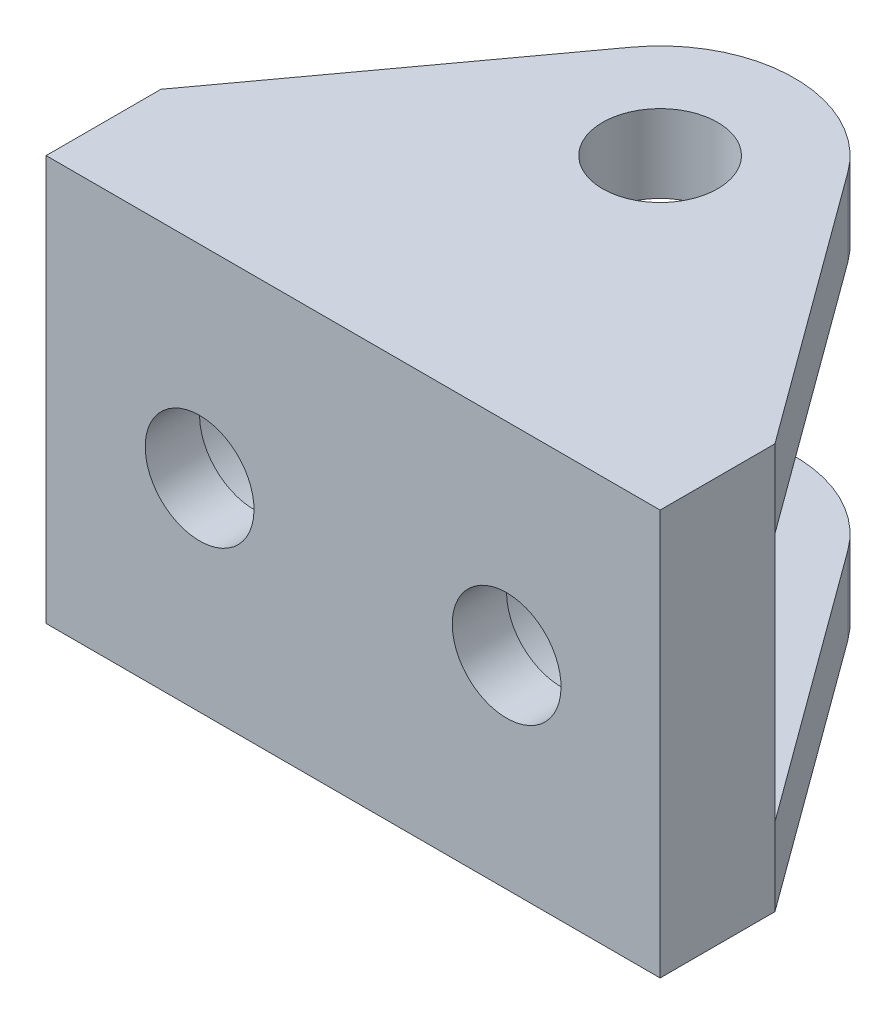
ISO-10303-21;
HEADER;
FILE_DESCRIPTION(('STEP AP214'),'2;1');
FILE_NAME('part.step','',(''),(''),'','','');
FILE_SCHEMA(('AUTOMOTIVE_DESIGN { 1 0 10303 214 1 1 1 1 }'));
ENDSEC;
DATA;
#1=APPLICATION_CONTEXT('core data for automotive mechanical design processes');
#2=APPLICATION_PROTOCOL_DEFINITION('international standard','automotive_design',2000,#1);
#3=PRODUCT_CONTEXT('',#1,'mechanical');
#4=PRODUCT('Part','Part','',(#3));
#5=PRODUCT_RELATED_PRODUCT_CATEGORY('part','',(#4));
#6=PRODUCT_DEFINITION_FORMATION('','',#4);
#7=PRODUCT_DEFINITION_CONTEXT('part definition',#1,'design');
#8=PRODUCT_DEFINITION('design','',#6,#7);
#9=PRODUCT_DEFINITION_SHAPE('','',#8);
#10=(LENGTH_UNIT() NAMED_UNIT(*) SI_UNIT(.MILLI.,.METRE.));
#11=(NAMED_UNIT(*) PLANE_ANGLE_UNIT() SI_UNIT($,.RADIAN.));
#12=(NAMED_UNIT(*) SI_UNIT($,.STERADIAN.) SOLID_ANGLE_UNIT());
#13=UNCERTAINTY_MEASURE_WITH_UNIT(LENGTH_MEASURE(1.E-05),#10,'distance_accuracy_value','');
#14=(GEOMETRIC_REPRESENTATION_CONTEXT(3) GLOBAL_UNCERTAINTY_ASSIGNED_CONTEXT((#13)) GLOBAL_UNIT_ASSIGNED_CONTEXT((#10,
#11,#12)) REPRESENTATION_CONTEXT('',''));
#15=CARTESIAN_POINT('',(0.,0.,0.));
#16=DIRECTION('',(0.,0.,1.));
#17=DIRECTION('',(1.,0.,0.));
#18=AXIS2_PLACEMENT_3D('',#15,#16,#17);
#19=CARTESIAN_POINT('',(50.8,33.528,-9.4996));
#20=DIRECTION('',(-0.807099806213913,0.,0.590415025900819));
#21=DIRECTION('',(0.590415025900819,0.,0.807099806213913));
#22=AXIS2_PLACEMENT_3D('',#19,#20,#21);
#23=PLANE('',#22);
#24=DIRECTION('',(0.,-1.,0.));
#25=VECTOR('',#24,1.);
#26=CARTESIAN_POINT('',(50.8,33.528,-9.4996));
#27=LINE('',#26,#25);
#28=CARTESIAN_POINT('',(50.8,33.528,-9.4996));
#29=VERTEX_POINT('',#28);
#30=CARTESIAN_POINT('',(50.8,27.0891,-9.4996));
#31=VERTEX_POINT('',#30);
#32=EDGE_CURVE('E181',#29,#31,#27,.T.);
#33=ORIENTED_EDGE('',*,*,#32,.T.);
#34=DIRECTION('',(-0.590415025900819,0.,-0.807099806213913));
#35=VECTOR('',#34,1.);
#36=CARTESIAN_POINT('',(50.8,27.0891,-9.4996));
#37=LINE('',#36,#35);
#38=CARTESIAN_POINT('',(34.3688965965521,27.0891,-31.9609869753228));
#39=VERTEX_POINT('',#38);
#40=EDGE_CURVE('E135',#31,#39,#37,.T.);
#41=ORIENTED_EDGE('',*,*,#40,.T.);
#42=DIRECTION('',(0.,-1.,0.));
#43=VECTOR('',#42,1.);
#44=CARTESIAN_POINT('',(34.3688965965521,33.528,-31.9609869753228));
#45=LINE('',#44,#43);
#46=CARTESIAN_POINT('',(34.3688965965521,33.528,-31.9609869753228));
#47=VERTEX_POINT('',#46);
#48=EDGE_CURVE('E133',#47,#39,#45,.T.);
#49=ORIENTED_EDGE('',*,*,#48,.F.);
#50=DIRECTION('',(-0.590415025900819,0.,-0.807099806213913));
#51=VECTOR('',#50,1.);
#52=CARTESIAN_POINT('',(50.8,33.528,-9.4996));
#53=LINE('',#52,#51);
#54=EDGE_CURVE('E117',#29,#47,#53,.T.);
#55=ORIENTED_EDGE('',*,*,#54,.F.);
#56=EDGE_LOOP('',(#33,#41,#49,#55));
#57=FACE_BOUND('',#56,.T.);
#58=ADVANCED_FACE('F45',(#57),#23,.F.);
#59=CARTESIAN_POINT('',(25.4,33.528,-25.4));
#60=DIRECTION('',(0.,-1.,0.));
#61=DIRECTION('',(0.,0.,-1.));
#62=AXIS2_PLACEMENT_3D('',#59,#60,#61);
#63=CYLINDRICAL_SURFACE('',#62,11.1125);
#64=ORIENTED_EDGE('',*,*,#48,.T.);
#65=CARTESIAN_POINT('',(25.4,27.0891,-25.4));
#66=DIRECTION('',(0.,1.,0.));
#67=DIRECTION('',(0.,0.,1.));
#68=AXIS2_PLACEMENT_3D('',#65,#66,#67);
#69=CIRCLE('',#68,11.1125);
#70=CARTESIAN_POINT('',(16.4311034034479,27.0891,-31.9609869753229));
#71=VERTEX_POINT('',#70);
#72=EDGE_CURVE('E221',#39,#71,#69,.T.);
#73=ORIENTED_EDGE('',*,*,#72,.T.);
#74=DIRECTION('',(0.,-1.,0.));
#75=VECTOR('',#74,1.);
#76=CARTESIAN_POINT('',(16.4311034034479,33.528,-31.9609869753229));
#77=LINE('',#76,#75);
#78=CARTESIAN_POINT('',(16.4311034034479,33.528,-31.9609869753229));
#79=VERTEX_POINT('',#78);
#80=EDGE_CURVE('E144',#79,#71,#77,.T.);
#81=ORIENTED_EDGE('',*,*,#80,.F.);
#82=CARTESIAN_POINT('',(25.4,33.528,-25.4));
#83=DIRECTION('',(0.,1.,0.));
#84=DIRECTION('',(0.,0.,1.));
#85=AXIS2_PLACEMENT_3D('',#82,#83,#84);
#86=CIRCLE('',#85,11.1125);
#87=EDGE_CURVE('E122',#47,#79,#86,.T.);
#88=ORIENTED_EDGE('',*,*,#87,.F.);
#89=EDGE_LOOP('',(#64,#73,#81,#88));
#90=FACE_BOUND('',#89,.T.);
#91=ADVANCED_FACE('F142',(#90),#63,.T.);
#92=CARTESIAN_POINT('',(0.,33.528,-9.4996));
#93=DIRECTION('',(0.807099806213913,0.,0.590415025900819));
#94=DIRECTION('',(0.590415025900819,0.,-0.807099806213913));
#95=AXIS2_PLACEMENT_3D('',#92,#93,#94);
#96=PLANE('',#95);
#97=ORIENTED_EDGE('',*,*,#80,.T.);
#98=DIRECTION('',(-0.590415025900819,0.,0.807099806213913));
#99=VECTOR('',#98,1.);
#100=CARTESIAN_POINT('',(0.,27.0891,-9.4996));
#101=LINE('',#100,#99);
#102=CARTESIAN_POINT('',(0.,27.0891,-9.49959999999996));
#103=VERTEX_POINT('',#102);
#104=EDGE_CURVE('E217',#71,#103,#101,.T.);
#105=ORIENTED_EDGE('',*,*,#104,.T.);
#106=DIRECTION('',(0.,-1.,0.));
#107=VECTOR('',#106,1.);
#108=CARTESIAN_POINT('',(0.,33.528,-9.4996));
#109=LINE('',#108,#107);
#110=CARTESIAN_POINT('',(0.,33.528,-9.4996));
#111=VERTEX_POINT('',#110);
#112=EDGE_CURVE('E174',#111,#103,#109,.T.);
#113=ORIENTED_EDGE('',*,*,#112,.F.);
#114=DIRECTION('',(-0.590415025900819,0.,0.807099806213913));
#115=VECTOR('',#114,1.);
#116=CARTESIAN_POINT('',(0.,33.528,-9.4996));
#117=LINE('',#116,#115);
#118=EDGE_CURVE('E72',#79,#111,#117,.T.);
#119=ORIENTED_EDGE('',*,*,#118,.F.);
#120=EDGE_LOOP('',(#97,#105,#113,#119));
#121=FACE_BOUND('',#120,.T.);
#122=ADVANCED_FACE('F247',(#121),#96,.F.);
#123=CARTESIAN_POINT('',(25.4,33.528,-25.4));
#124=DIRECTION('',(0.,-1.,0.));
#125=DIRECTION('',(0.,0.,-1.));
#126=AXIS2_PLACEMENT_3D('',#123,#124,#125);
#127=CYLINDRICAL_SURFACE('',#126,4.7625);
#128=CARTESIAN_POINT('',(25.4,27.0891,-25.4));
#129=DIRECTION('',(0.,1.,0.));
#130=DIRECTION('',(0.,0.,1.));
#131=AXIS2_PLACEMENT_3D('',#128,#129,#130);
#132=CIRCLE('',#131,4.7625);
#133=CARTESIAN_POINT('',(25.4,27.0891,-20.6375));
#134=VERTEX_POINT('',#133);
#135=EDGE_CURVE('E49',#134,#134,#132,.T.);
#136=ORIENTED_EDGE('',*,*,#135,.F.);
#137=EDGE_LOOP('',(#136));
#138=FACE_BOUND('',#137,.T.);
#139=CARTESIAN_POINT('',(25.4,33.528,-25.4));
#140=DIRECTION('',(0.,1.,0.));
#141=DIRECTION('',(0.,0.,1.));
#142=AXIS2_PLACEMENT_3D('',#139,#140,#141);
#143=CIRCLE('',#142,4.7625);
#144=CARTESIAN_POINT('',(25.4,33.528,-20.6375));
#145=VERTEX_POINT('',#144);
#146=EDGE_CURVE('E155',#145,#145,#143,.T.);
#147=ORIENTED_EDGE('',*,*,#146,.T.);
#148=EDGE_LOOP('',(#147));
#149=FACE_BOUND('',#148,.T.);
#150=ADVANCED_FACE('F244',(#138,#149),#127,.F.);
#151=CARTESIAN_POINT('',(25.4,33.528,-25.4));
#152=DIRECTION('',(0.,1.,0.));
#153=DIRECTION('',(0.,0.,1.));
#154=AXIS2_PLACEMENT_3D('',#151,#152,#153);
#155=PLANE('',#154);
#156=DIRECTION('',(0.,0.,1.));
#157=VECTOR('',#156,1.);
#158=CARTESIAN_POINT('',(0.,33.528,0.));
#159=LINE('',#158,#157);
#160=CARTESIAN_POINT('',(0.,33.528,0.));
#161=VERTEX_POINT('',#160);
#162=EDGE_CURVE('E173',#111,#161,#159,.T.);
#163=ORIENTED_EDGE('',*,*,#162,.T.);
#164=DIRECTION('',(1.,0.,0.));
#165=VECTOR('',#164,1.);
#166=CARTESIAN_POINT('',(0.,33.528,0.));
#167=LINE('',#166,#165);
#168=CARTESIAN_POINT('',(50.8,33.528,0.));
#169=VERTEX_POINT('',#168);
#170=EDGE_CURVE('E108',#161,#169,#167,.T.);
#171=ORIENTED_EDGE('',*,*,#170,.T.);
#172=DIRECTION('',(0.,0.,-1.));
#173=VECTOR('',#172,1.);
#174=CARTESIAN_POINT('',(50.8,33.528,0.));
#175=LINE('',#174,#173);
#176=EDGE_CURVE('E125',#169,#29,#175,.T.);
#177=ORIENTED_EDGE('',*,*,#176,.T.);
#178=ORIENTED_EDGE('',*,*,#54,.T.);
#179=ORIENTED_EDGE('',*,*,#87,.T.);
#180=ORIENTED_EDGE('',*,*,#118,.T.);
#181=EDGE_LOOP('',(#163,#171,#177,#178,#179,#180));
#182=FACE_BOUND('',#181,.T.);
#183=ORIENTED_EDGE('',*,*,#146,.F.);
#184=EDGE_LOOP('',(#183));
#185=FACE_BOUND('',#184,.T.);
#186=ADVANCED_FACE('F119',(#182,#185),#155,.T.);
#187=CARTESIAN_POINT('',(25.4,0.,-25.4));
#188=DIRECTION('',(0.,1.,0.));
#189=DIRECTION('',(0.,0.,1.));
#190=AXIS2_PLACEMENT_3D('',#187,#188,#189);
#191=PLANE('',#190);
#192=DIRECTION('',(0.,0.,1.));
#193=VECTOR('',#192,1.);
#194=CARTESIAN_POINT('',(0.,0.,0.));
#195=LINE('',#194,#193);
#196=CARTESIAN_POINT('',(0.,0.,-9.4996));
#197=VERTEX_POINT('',#196);
#198=CARTESIAN_POINT('',(0.,0.,0.));
#199=VERTEX_POINT('',#198);
#200=EDGE_CURVE('E151',#197,#199,#195,.T.);
#201=ORIENTED_EDGE('',*,*,#200,.F.);
#202=DIRECTION('',(-0.590415025900819,0.,0.807099806213913));
#203=VECTOR('',#202,1.);
#204=CARTESIAN_POINT('',(0.,0.,-9.4996));
#205=LINE('',#204,#203);
#206=CARTESIAN_POINT('',(16.4311034034479,0.,-31.9609869753229));
#207=VERTEX_POINT('',#206);
#208=EDGE_CURVE('E170',#207,#197,#205,.T.);
#209=ORIENTED_EDGE('',*,*,#208,.F.);
#210=CARTESIAN_POINT('',(25.4,0.,-25.4));
#211=DIRECTION('',(0.,1.,0.));
#212=DIRECTION('',(0.,0.,1.));
#213=AXIS2_PLACEMENT_3D('',#210,#211,#212);
#214=CIRCLE('',#213,11.1125);
#215=CARTESIAN_POINT('',(34.3688965965521,0.,-31.9609869753228));
#216=VERTEX_POINT('',#215);
#217=EDGE_CURVE('E166',#216,#207,#214,.T.);
#218=ORIENTED_EDGE('',*,*,#217,.F.);
#219=DIRECTION('',(-0.590415025900819,0.,-0.807099806213913));
#220=VECTOR('',#219,1.);
#221=CARTESIAN_POINT('',(50.8,0.,-9.4996));
#222=LINE('',#221,#220);
#223=CARTESIAN_POINT('',(50.8,0.,-9.4996));
#224=VERTEX_POINT('',#223);
#225=EDGE_CURVE('E162',#224,#216,#222,.T.);
#226=ORIENTED_EDGE('',*,*,#225,.F.);
#227=DIRECTION('',(0.,0.,-1.));
#228=VECTOR('',#227,1.);
#229=CARTESIAN_POINT('',(50.8,0.,0.));
#230=LINE('',#229,#228);
#231=CARTESIAN_POINT('',(50.8,0.,0.));
#232=VERTEX_POINT('',#231);
#233=EDGE_CURVE('E158',#232,#224,#230,.T.);
#234=ORIENTED_EDGE('',*,*,#233,.F.);
#235=DIRECTION('',(1.,0.,0.));
#236=VECTOR('',#235,1.);
#237=CARTESIAN_POINT('',(0.,0.,0.));
#238=LINE('',#237,#236);
#239=EDGE_CURVE('E154',#199,#232,#238,.T.);
#240=ORIENTED_EDGE('',*,*,#239,.F.);
#241=EDGE_LOOP('',(#201,#209,#218,#226,#234,#240));
#242=FACE_BOUND('',#241,.T.);
#243=CARTESIAN_POINT('',(25.4,0.,-25.4));
#244=DIRECTION('',(0.,1.,0.));
#245=DIRECTION('',(0.,0.,1.));
#246=AXIS2_PLACEMENT_3D('',#243,#244,#245);
#247=CIRCLE('',#246,4.7625);
#248=CARTESIAN_POINT('',(25.4,0.,-20.6375));
#249=VERTEX_POINT('',#248);
#250=EDGE_CURVE('E226',#249,#249,#247,.T.);
#251=ORIENTED_EDGE('',*,*,#250,.T.);
#252=EDGE_LOOP('',(#251));
#253=FACE_BOUND('',#252,.T.);
#254=ADVANCED_FACE('F252',(#242,#253),#191,.F.);
#255=CARTESIAN_POINT('',(0.,33.528,0.));
#256=DIRECTION('',(1.,0.,0.));
#257=DIRECTION('',(0.,0.,-1.));
#258=AXIS2_PLACEMENT_3D('',#255,#256,#257);
#259=PLANE('',#258);
#260=ORIENTED_EDGE('',*,*,#200,.T.);
#261=DIRECTION('',(0.,-1.,0.));
#262=VECTOR('',#261,1.);
#263=CARTESIAN_POINT('',(0.,33.528,0.));
#264=LINE('',#263,#262);
#265=EDGE_CURVE('E11',#161,#199,#264,.T.);
#266=ORIENTED_EDGE('',*,*,#265,.F.);
#267=ORIENTED_EDGE('',*,*,#162,.F.);
#268=ORIENTED_EDGE('',*,*,#112,.T.);
#269=DIRECTION('',(0.,-1.,0.));
#270=VECTOR('',#269,1.);
#271=CARTESIAN_POINT('',(0.,16.764,-9.49959999999997));
#272=LINE('',#271,#270);
#273=CARTESIAN_POINT('',(0.,6.4389,-9.4996));
#274=VERTEX_POINT('',#273);
#275=EDGE_CURVE('E204',#103,#274,#272,.T.);
#276=ORIENTED_EDGE('',*,*,#275,.T.);
#277=EDGE_CURVE('E100',#274,#197,#109,.T.);
#278=ORIENTED_EDGE('',*,*,#277,.T.);
#279=EDGE_LOOP('',(#260,#266,#267,#268,#276,#278));
#280=FACE_BOUND('',#279,.T.);
#281=ADVANCED_FACE('F47',(#280),#259,.F.);
#282=CARTESIAN_POINT('',(0.,33.528,0.));
#283=DIRECTION('',(0.,0.,-1.));
#284=DIRECTION('',(-1.,0.,0.));
#285=AXIS2_PLACEMENT_3D('',#282,#283,#284);
#286=PLANE('',#285);
#287=CARTESIAN_POINT('',(38.1,16.764,0.));
#288=DIRECTION('',(0.,0.,-1.));
#289=DIRECTION('',(0.,1.,0.));
#290=AXIS2_PLACEMENT_3D('',#287,#288,#289);
#291=CIRCLE('',#290,4.5);
#292=CARTESIAN_POINT('',(38.1,21.264,0.));
#293=VERTEX_POINT('',#292);
#294=EDGE_CURVE('E329',#293,#293,#291,.T.);
#295=ORIENTED_EDGE('',*,*,#294,.T.);
#296=EDGE_LOOP('',(#295));
#297=FACE_BOUND('',#296,.T.);
#298=CARTESIAN_POINT('',(12.7,16.764,0.));
#299=DIRECTION('',(0.,0.,-1.));
#300=DIRECTION('',(0.,1.,0.));
#301=AXIS2_PLACEMENT_3D('',#298,#299,#300);
#302=CIRCLE('',#301,4.5);
#303=CARTESIAN_POINT('',(12.7,21.264,0.));
#304=VERTEX_POINT('',#303);
#305=EDGE_CURVE('E312',#304,#304,#302,.T.);
#306=ORIENTED_EDGE('',*,*,#305,.T.);
#307=EDGE_LOOP('',(#306));
#308=FACE_BOUND('',#307,.T.);
#309=ORIENTED_EDGE('',*,*,#239,.T.);
#310=DIRECTION('',(0.,-1.,0.));
#311=VECTOR('',#310,1.);
#312=CARTESIAN_POINT('',(50.8,33.528,0.));
#313=LINE('',#312,#311);
#314=EDGE_CURVE('E55',#169,#232,#313,.T.);
#315=ORIENTED_EDGE('',*,*,#314,.F.);
#316=ORIENTED_EDGE('',*,*,#170,.F.);
#317=ORIENTED_EDGE('',*,*,#265,.T.);
#318=EDGE_LOOP('',(#309,#315,#316,#317));
#319=FACE_BOUND('',#318,.T.);
#320=ADVANCED_FACE('F277',(#297,#308,#319),#286,.F.);
#321=CARTESIAN_POINT('',(50.8,33.528,0.));
#322=DIRECTION('',(-1.,0.,0.));
#323=DIRECTION('',(0.,0.,1.));
#324=AXIS2_PLACEMENT_3D('',#321,#322,#323);
#325=PLANE('',#324);
#326=ORIENTED_EDGE('',*,*,#233,.T.);
#327=CARTESIAN_POINT('',(50.8,6.4389,-9.4996));
#328=VERTEX_POINT('',#327);
#329=EDGE_CURVE('E139',#328,#224,#27,.T.);
#330=ORIENTED_EDGE('',*,*,#329,.F.);
#331=DIRECTION('',(0.,-1.,0.));
#332=VECTOR('',#331,1.);
#333=CARTESIAN_POINT('',(50.8,16.764,-9.4996));
#334=LINE('',#333,#332);
#335=EDGE_CURVE('E207',#31,#328,#334,.T.);
#336=ORIENTED_EDGE('',*,*,#335,.F.);
#337=ORIENTED_EDGE('',*,*,#32,.F.);
#338=ORIENTED_EDGE('',*,*,#176,.F.);
#339=ORIENTED_EDGE('',*,*,#314,.T.);
#340=EDGE_LOOP('',(#326,#330,#336,#337,#338,#339));
#341=FACE_BOUND('',#340,.T.);
#342=ADVANCED_FACE('F269',(#341),#325,.F.);
#343=CARTESIAN_POINT('',(34.3688965965521,6.4389,-31.9609869753228));
#344=VERTEX_POINT('',#343);
#345=EDGE_CURVE('E140',#344,#216,#45,.T.);
#346=ORIENTED_EDGE('',*,*,#345,.F.);
#347=DIRECTION('',(0.590415025900819,0.,0.807099806213913));
#348=VECTOR('',#347,1.);
#349=CARTESIAN_POINT('',(50.8,6.4389,-9.4996));
#350=LINE('',#349,#348);
#351=EDGE_CURVE('E213',#344,#328,#350,.T.);
#352=ORIENTED_EDGE('',*,*,#351,.T.);
#353=ORIENTED_EDGE('',*,*,#329,.T.);
#354=ORIENTED_EDGE('',*,*,#225,.T.);
#355=EDGE_LOOP('',(#346,#352,#353,#354));
#356=FACE_BOUND('',#355,.T.);
#357=ADVANCED_FACE('F261',(#356),#23,.F.);
#358=CARTESIAN_POINT('',(16.4311034034479,6.4389,-31.9609869753229));
#359=VERTEX_POINT('',#358);
#360=EDGE_CURVE('E178',#359,#207,#77,.T.);
#361=ORIENTED_EDGE('',*,*,#360,.F.);
#362=CARTESIAN_POINT('',(25.4,6.4389,-25.4));
#363=DIRECTION('',(0.,-1.,0.));
#364=DIRECTION('',(0.,0.,-1.));
#365=AXIS2_PLACEMENT_3D('',#362,#363,#364);
#366=CIRCLE('',#365,11.1125);
#367=EDGE_CURVE('E196',#359,#344,#366,.T.);
#368=ORIENTED_EDGE('',*,*,#367,.T.);
#369=ORIENTED_EDGE('',*,*,#345,.T.);
#370=ORIENTED_EDGE('',*,*,#217,.T.);
#371=EDGE_LOOP('',(#361,#368,#369,#370));
#372=FACE_BOUND('',#371,.T.);
#373=ADVANCED_FACE('F266',(#372),#63,.T.);
#374=ORIENTED_EDGE('',*,*,#277,.F.);
#375=DIRECTION('',(0.590415025900819,0.,-0.807099806213913));
#376=VECTOR('',#375,1.);
#377=CARTESIAN_POINT('',(0.,6.4389,-9.4996));
#378=LINE('',#377,#376);
#379=EDGE_CURVE('E189',#274,#359,#378,.T.);
#380=ORIENTED_EDGE('',*,*,#379,.T.);
#381=ORIENTED_EDGE('',*,*,#360,.T.);
#382=ORIENTED_EDGE('',*,*,#208,.T.);
#383=EDGE_LOOP('',(#374,#380,#381,#382));
#384=FACE_BOUND('',#383,.T.);
#385=ADVANCED_FACE('F275',(#384),#96,.F.);
#386=CARTESIAN_POINT('',(25.4,6.4389,-25.4));
#387=DIRECTION('',(0.,-1.,0.));
#388=DIRECTION('',(0.,0.,-1.));
#389=AXIS2_PLACEMENT_3D('',#386,#387,#388);
#390=CIRCLE('',#389,4.7625);
#391=CARTESIAN_POINT('',(25.4,6.4389,-30.1625));
#392=VERTEX_POINT('',#391);
#393=EDGE_CURVE('E186',#392,#392,#390,.T.);
#394=ORIENTED_EDGE('',*,*,#393,.F.);
#395=EDGE_LOOP('',(#394));
#396=FACE_BOUND('',#395,.T.);
#397=ORIENTED_EDGE('',*,*,#250,.F.);
#398=EDGE_LOOP('',(#397));
#399=FACE_BOUND('',#398,.T.);
#400=ADVANCED_FACE('F249',(#396,#399),#127,.F.);
#401=CARTESIAN_POINT('',(0.,27.0891,-9.49959999999996));
#402=DIRECTION('',(0.,1.,0.));
#403=DIRECTION('',(0.,0.,1.));
#404=AXIS2_PLACEMENT_3D('',#401,#402,#403);
#405=PLANE('',#404);
#406=ORIENTED_EDGE('',*,*,#135,.T.);
#407=EDGE_LOOP('',(#406));
#408=FACE_BOUND('',#407,.T.);
#409=DIRECTION('',(1.,0.,0.));
#410=VECTOR('',#409,1.);
#411=CARTESIAN_POINT('',(0.,27.0891,-9.49959999999996));
#412=LINE('',#411,#410);
#413=EDGE_CURVE('E190',#103,#31,#412,.T.);
#414=ORIENTED_EDGE('',*,*,#413,.F.);
#415=ORIENTED_EDGE('',*,*,#104,.F.);
#416=ORIENTED_EDGE('',*,*,#72,.F.);
#417=ORIENTED_EDGE('',*,*,#40,.F.);
#418=EDGE_LOOP('',(#414,#415,#416,#417));
#419=FACE_BOUND('',#418,.T.);
#420=ADVANCED_FACE('F241',(#408,#419),#405,.F.);
#421=CARTESIAN_POINT('',(0.,6.4389,-9.49959999999997));
#422=DIRECTION('',(0.,-1.,0.));
#423=DIRECTION('',(0.,0.,-1.));
#424=AXIS2_PLACEMENT_3D('',#421,#422,#423);
#425=PLANE('',#424);
#426=ORIENTED_EDGE('',*,*,#393,.T.);
#427=EDGE_LOOP('',(#426));
#428=FACE_BOUND('',#427,.T.);
#429=ORIENTED_EDGE('',*,*,#367,.F.);
#430=ORIENTED_EDGE('',*,*,#379,.F.);
#431=DIRECTION('',(1.,0.,0.));
#432=VECTOR('',#431,1.);
#433=CARTESIAN_POINT('',(0.,6.4389,-9.49959999999997));
#434=LINE('',#433,#432);
#435=EDGE_CURVE('E63',#274,#328,#434,.T.);
#436=ORIENTED_EDGE('',*,*,#435,.T.);
#437=ORIENTED_EDGE('',*,*,#351,.F.);
#438=EDGE_LOOP('',(#429,#430,#436,#437));
#439=FACE_BOUND('',#438,.T.);
#440=ADVANCED_FACE('F352',(#428,#439),#425,.F.);
#441=CARTESIAN_POINT('',(0.,16.764,-9.49959999999997));
#442=DIRECTION('',(0.,0.,1.));
#443=DIRECTION('',(1.,0.,0.));
#444=AXIS2_PLACEMENT_3D('',#441,#442,#443);
#445=PLANE('',#444);
#446=CARTESIAN_POINT('',(38.1,16.764,-9.49959999999999));
#447=DIRECTION('',(0.,0.,-1.));
#448=DIRECTION('',(0.,1.,0.));
#449=AXIS2_PLACEMENT_3D('',#446,#447,#448);
#450=CIRCLE('',#449,7.99999999999999);
#451=CARTESIAN_POINT('',(38.1,24.764,-9.49959999999999));
#452=VERTEX_POINT('',#451);
#453=EDGE_CURVE('E341',#452,#452,#450,.T.);
#454=ORIENTED_EDGE('',*,*,#453,.F.);
#455=EDGE_LOOP('',(#454));
#456=FACE_BOUND('',#455,.T.);
#457=CARTESIAN_POINT('',(12.7,16.764,-9.49959999999998));
#458=DIRECTION('',(0.,0.,-1.));
#459=DIRECTION('',(0.,1.,0.));
#460=AXIS2_PLACEMENT_3D('',#457,#458,#459);
#461=CIRCLE('',#460,8.);
#462=CARTESIAN_POINT('',(12.7,24.764,-9.49959999999997));
#463=VERTEX_POINT('',#462);
#464=EDGE_CURVE('E325',#463,#463,#461,.T.);
#465=ORIENTED_EDGE('',*,*,#464,.F.);
#466=EDGE_LOOP('',(#465));
#467=FACE_BOUND('',#466,.T.);
#468=ORIENTED_EDGE('',*,*,#335,.T.);
#469=ORIENTED_EDGE('',*,*,#435,.F.);
#470=ORIENTED_EDGE('',*,*,#275,.F.);
#471=ORIENTED_EDGE('',*,*,#413,.T.);
#472=EDGE_LOOP('',(#468,#469,#470,#471));
#473=FACE_BOUND('',#472,.T.);
#474=ADVANCED_FACE('F348',(#456,#467,#473),#445,.F.);
#475=CARTESIAN_POINT('',(12.7,16.764,-9.49959999999998));
#476=DIRECTION('',(0.,0.,-1.));
#477=DIRECTION('',(0.,1.,0.));
#478=AXIS2_PLACEMENT_3D('',#475,#476,#477);
#479=CYLINDRICAL_SURFACE('',#478,4.5);
#480=ORIENTED_EDGE('',*,*,#305,.F.);
#481=EDGE_LOOP('',(#480));
#482=FACE_BOUND('',#481,.T.);
#483=CARTESIAN_POINT('',(12.7,16.764,-4.49959999999998));
#484=DIRECTION('',(0.,0.,-1.));
#485=DIRECTION('',(0.,1.,0.));
#486=AXIS2_PLACEMENT_3D('',#483,#484,#485);
#487=CIRCLE('',#486,4.5);
#488=CARTESIAN_POINT('',(12.7,21.264,-4.49959999999998));
#489=VERTEX_POINT('',#488);
#490=EDGE_CURVE('E317',#489,#489,#487,.T.);
#491=ORIENTED_EDGE('',*,*,#490,.T.);
#492=EDGE_LOOP('',(#491));
#493=FACE_BOUND('',#492,.T.);
#494=ADVANCED_FACE('F351',(#482,#493),#479,.F.);
#495=CARTESIAN_POINT('',(17.2,16.764,-4.49959999999998));
#496=DIRECTION('',(0.,0.,1.));
#497=DIRECTION('',(0.,-1.,0.));
#498=AXIS2_PLACEMENT_3D('',#495,#496,#497);
#499=PLANE('',#498);
#500=ORIENTED_EDGE('',*,*,#490,.F.);
#501=EDGE_LOOP('',(#500));
#502=FACE_BOUND('',#501,.T.);
#503=CARTESIAN_POINT('',(12.7,16.764,-4.49959999999998));
#504=DIRECTION('',(0.,0.,-1.));
#505=DIRECTION('',(0.,1.,0.));
#506=AXIS2_PLACEMENT_3D('',#503,#504,#505);
#507=CIRCLE('',#506,8.);
#508=CARTESIAN_POINT('',(12.7,24.764,-4.49959999999998));
#509=VERTEX_POINT('',#508);
#510=EDGE_CURVE('E321',#509,#509,#507,.T.);
#511=ORIENTED_EDGE('',*,*,#510,.T.);
#512=EDGE_LOOP('',(#511));
#513=FACE_BOUND('',#512,.T.);
#514=ADVANCED_FACE('F456',(#502,#513),#499,.F.);
#515=CARTESIAN_POINT('',(12.7,16.764,-9.49959999999998));
#516=DIRECTION('',(0.,0.,-1.));
#517=DIRECTION('',(0.,1.,0.));
#518=AXIS2_PLACEMENT_3D('',#515,#516,#517);
#519=CYLINDRICAL_SURFACE('',#518,8.);
#520=ORIENTED_EDGE('',*,*,#510,.F.);
#521=EDGE_LOOP('',(#520));
#522=FACE_BOUND('',#521,.T.);
#523=ORIENTED_EDGE('',*,*,#464,.T.);
#524=EDGE_LOOP('',(#523));
#525=FACE_BOUND('',#524,.T.);
#526=ADVANCED_FACE('F466',(#522,#525),#519,.F.);
#527=CARTESIAN_POINT('',(38.1,16.764,-9.49959999999999));
#528=DIRECTION('',(0.,0.,-1.));
#529=DIRECTION('',(0.,1.,0.));
#530=AXIS2_PLACEMENT_3D('',#527,#528,#529);
#531=CYLINDRICAL_SURFACE('',#530,4.5);
#532=ORIENTED_EDGE('',*,*,#294,.F.);
#533=EDGE_LOOP('',(#532));
#534=FACE_BOUND('',#533,.T.);
#535=CARTESIAN_POINT('',(38.1,16.764,-4.49959999999999));
#536=DIRECTION('',(0.,0.,-1.));
#537=DIRECTION('',(0.,1.,0.));
#538=AXIS2_PLACEMENT_3D('',#535,#536,#537);
#539=CIRCLE('',#538,4.5);
#540=CARTESIAN_POINT('',(38.1,21.264,-4.49959999999999));
#541=VERTEX_POINT('',#540);
#542=EDGE_CURVE('E333',#541,#541,#539,.T.);
#543=ORIENTED_EDGE('',*,*,#542,.T.);
#544=EDGE_LOOP('',(#543));
#545=FACE_BOUND('',#544,.T.);
#546=ADVANCED_FACE('F476',(#534,#545),#531,.F.);
#547=CARTESIAN_POINT('',(42.6,16.764,-4.49959999999999));
#548=DIRECTION('',(0.,0.,1.));
#549=DIRECTION('',(0.,-1.,0.));
#550=AXIS2_PLACEMENT_3D('',#547,#548,#549);
#551=PLANE('',#550);
#552=ORIENTED_EDGE('',*,*,#542,.F.);
#553=EDGE_LOOP('',(#552));
#554=FACE_BOUND('',#553,.T.);
#555=CARTESIAN_POINT('',(38.1,16.764,-4.49959999999999));
#556=DIRECTION('',(0.,0.,-1.));
#557=DIRECTION('',(0.,1.,0.));
#558=AXIS2_PLACEMENT_3D('',#555,#556,#557);
#559=CIRCLE('',#558,8.);
#560=CARTESIAN_POINT('',(38.1,24.764,-4.49959999999999));
#561=VERTEX_POINT('',#560);
#562=EDGE_CURVE('E337',#561,#561,#559,.T.);
#563=ORIENTED_EDGE('',*,*,#562,.T.);
#564=EDGE_LOOP('',(#563));
#565=FACE_BOUND('',#564,.T.);
#566=ADVANCED_FACE('F486',(#554,#565),#551,.F.);
#567=CARTESIAN_POINT('',(38.1,16.764,-9.49959999999999));
#568=DIRECTION('',(0.,0.,-1.));
#569=DIRECTION('',(0.,1.,0.));
#570=AXIS2_PLACEMENT_3D('',#567,#568,#569);
#571=CYLINDRICAL_SURFACE('',#570,8.);
#572=ORIENTED_EDGE('',*,*,#562,.F.);
#573=EDGE_LOOP('',(#572));
#574=FACE_BOUND('',#573,.T.);
#575=ORIENTED_EDGE('',*,*,#453,.T.);
#576=EDGE_LOOP('',(#575));
#577=FACE_BOUND('',#576,.T.);
#578=ADVANCED_FACE('F346',(#574,#577),#571,.F.);
#579=CLOSED_SHELL('',(#58,#91,#122,#150,#186,#254,#281,#320,#342,#357,#373,#385,#400,#420,#440,
#474,#494,#514,#526,#546,#566,#578));
#580=MANIFOLD_SOLID_BREP('B2',#579);
#581=ADVANCED_BREP_SHAPE_REPRESENTATION('',(#18,#580),#14);
#582=SHAPE_DEFINITION_REPRESENTATION(#9,#581);
ENDSEC;
END-ISO-10303-21;
